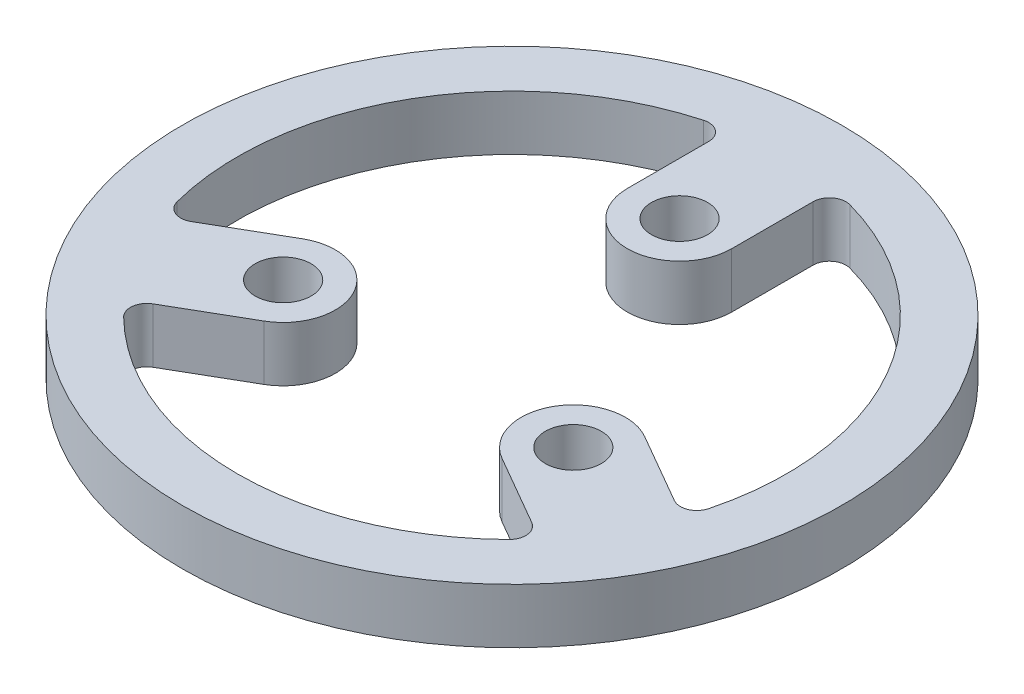
ISO-10303-21;
HEADER;
FILE_DESCRIPTION(('STEP AP214'),'2;1');
FILE_NAME('part.step','',(''),(''),'','','');
FILE_SCHEMA(('AUTOMOTIVE_DESIGN { 1 0 10303 214 1 1 1 1 }'));
ENDSEC;
DATA;
#1=APPLICATION_CONTEXT('core data for automotive mechanical design processes');
#2=APPLICATION_PROTOCOL_DEFINITION('international standard','automotive_design',2000,#1);
#3=PRODUCT_CONTEXT('',#1,'mechanical');
#4=PRODUCT('Part','Part','',(#3));
#5=PRODUCT_RELATED_PRODUCT_CATEGORY('part','',(#4));
#6=PRODUCT_DEFINITION_FORMATION('','',#4);
#7=PRODUCT_DEFINITION_CONTEXT('part definition',#1,'design');
#8=PRODUCT_DEFINITION('design','',#6,#7);
#9=PRODUCT_DEFINITION_SHAPE('','',#8);
#10=(LENGTH_UNIT() NAMED_UNIT(*) SI_UNIT(.MILLI.,.METRE.));
#11=(NAMED_UNIT(*) PLANE_ANGLE_UNIT() SI_UNIT($,.RADIAN.));
#12=(NAMED_UNIT(*) SI_UNIT($,.STERADIAN.) SOLID_ANGLE_UNIT());
#13=UNCERTAINTY_MEASURE_WITH_UNIT(LENGTH_MEASURE(1.E-05),#10,'distance_accuracy_value','');
#14=(GEOMETRIC_REPRESENTATION_CONTEXT(3) GLOBAL_UNCERTAINTY_ASSIGNED_CONTEXT((#13)) GLOBAL_UNIT_ASSIGNED_CONTEXT((#10,
#11,#12)) REPRESENTATION_CONTEXT('',''));
#15=CARTESIAN_POINT('',(0.,0.,0.));
#16=DIRECTION('',(0.,0.,1.));
#17=DIRECTION('',(1.,0.,0.));
#18=AXIS2_PLACEMENT_3D('',#15,#16,#17);
#19=CARTESIAN_POINT('',(0.,5.,0.));
#20=DIRECTION('',(0.,-1.,0.));
#21=DIRECTION('',(0.,0.,-1.));
#22=AXIS2_PLACEMENT_3D('',#19,#20,#21);
#23=CYLINDRICAL_SURFACE('',#22,25.);
#24=CARTESIAN_POINT('',(0.,5.,0.));
#25=DIRECTION('',(0.,1.,0.));
#26=DIRECTION('',(0.,0.,1.));
#27=AXIS2_PLACEMENT_3D('',#24,#25,#26);
#28=CIRCLE('',#27,25.);
#29=CARTESIAN_POINT('',(-6.64893617021277,5.,-24.0996192460469));
#30=VERTEX_POINT('',#29);
#31=CARTESIAN_POINT('',(-24.1953505737155,5.,6.29166199147778));
#32=VERTEX_POINT('',#31);
#33=EDGE_CURVE('E246',#30,#32,#28,.T.);
#34=ORIENTED_EDGE('',*,*,#33,.T.);
#35=DIRECTION('',(0.,-1.,0.));
#36=VECTOR('',#35,1.);
#37=CARTESIAN_POINT('',(-24.1953505737155,5.,6.29166199147778));
#38=LINE('',#37,#36);
#39=CARTESIAN_POINT('',(-24.1953505737155,0.,6.29166199147778));
#40=VERTEX_POINT('',#39);
#41=EDGE_CURVE('E280',#32,#40,#38,.T.);
#42=ORIENTED_EDGE('',*,*,#41,.T.);
#43=CARTESIAN_POINT('',(0.,0.,0.));
#44=DIRECTION('',(0.,1.,0.));
#45=DIRECTION('',(0.,0.,1.));
#46=AXIS2_PLACEMENT_3D('',#43,#44,#45);
#47=CIRCLE('',#46,25.);
#48=CARTESIAN_POINT('',(-6.64893617021277,0.,-24.0996192460469));
#49=VERTEX_POINT('',#48);
#50=EDGE_CURVE('E252',#49,#40,#47,.T.);
#51=ORIENTED_EDGE('',*,*,#50,.F.);
#52=DIRECTION('',(0.,-1.,0.));
#53=VECTOR('',#52,1.);
#54=CARTESIAN_POINT('',(-6.64893617021277,5.,-24.0996192460469));
#55=LINE('',#54,#53);
#56=EDGE_CURVE('E277',#49,#30,#55,.F.);
#57=ORIENTED_EDGE('',*,*,#56,.T.);
#58=EDGE_LOOP('',(#34,#42,#51,#57));
#59=FACE_BOUND('',#58,.T.);
#60=ADVANCED_FACE('F33',(#59),#23,.F.);
#61=CARTESIAN_POINT('',(-17.5464144035028,5.,17.8079572545688));
#62=VERTEX_POINT('',#61);
#63=CARTESIAN_POINT('',(17.5464144035026,5.,17.807957254569));
#64=VERTEX_POINT('',#63);
#65=EDGE_CURVE('E250',#62,#64,#28,.T.);
#66=ORIENTED_EDGE('',*,*,#65,.T.);
#67=DIRECTION('',(0.,-1.,0.));
#68=VECTOR('',#67,1.);
#69=CARTESIAN_POINT('',(17.5464144035026,5.,17.807957254569));
#70=LINE('',#69,#68);
#71=CARTESIAN_POINT('',(17.5464144035026,0.,17.807957254569));
#72=VERTEX_POINT('',#71);
#73=EDGE_CURVE('E274',#64,#72,#70,.T.);
#74=ORIENTED_EDGE('',*,*,#73,.T.);
#75=CARTESIAN_POINT('',(-17.5464144035028,0.,17.8079572545688));
#76=VERTEX_POINT('',#75);
#77=EDGE_CURVE('E255',#76,#72,#47,.T.);
#78=ORIENTED_EDGE('',*,*,#77,.F.);
#79=DIRECTION('',(0.,-1.,0.));
#80=VECTOR('',#79,1.);
#81=CARTESIAN_POINT('',(-17.5464144035028,5.,17.8079572545688));
#82=LINE('',#81,#80);
#83=EDGE_CURVE('E271',#76,#62,#82,.F.);
#84=ORIENTED_EDGE('',*,*,#83,.T.);
#85=EDGE_LOOP('',(#66,#74,#78,#84));
#86=FACE_BOUND('',#85,.T.);
#87=ADVANCED_FACE('F332',(#86),#23,.F.);
#88=CARTESIAN_POINT('',(0.,5.,0.));
#89=DIRECTION('',(0.,1.,0.));
#90=DIRECTION('',(0.,0.,1.));
#91=AXIS2_PLACEMENT_3D('',#88,#89,#90);
#92=PLANE('',#91);
#93=CARTESIAN_POINT('',(0.,5.,0.));
#94=DIRECTION('',(0.,1.,0.));
#95=DIRECTION('',(0.,0.,1.));
#96=AXIS2_PLACEMENT_3D('',#93,#94,#95);
#97=CIRCLE('',#96,30.);
#98=CARTESIAN_POINT('',(0.,5.,30.));
#99=VERTEX_POINT('',#98);
#100=EDGE_CURVE('E256',#99,#99,#97,.T.);
#101=ORIENTED_EDGE('',*,*,#100,.T.);
#102=EDGE_LOOP('',(#101));
#103=FACE_BOUND('',#102,.T.);
#104=ORIENTED_EDGE('',*,*,#33,.F.);
#105=CARTESIAN_POINT('',(-6.25,5.,-22.6536420912841));
#106=DIRECTION('',(0.,1.,0.));
#107=DIRECTION('',(0.,0.,1.));
#108=AXIS2_PLACEMENT_3D('',#105,#106,#107);
#109=CIRCLE('',#108,1.5);
#110=CARTESIAN_POINT('',(-4.75,5.,-22.6536420912841));
#111=VERTEX_POINT('',#110);
#112=EDGE_CURVE('E41',#30,#111,#109,.F.);
#113=ORIENTED_EDGE('',*,*,#112,.T.);
#114=DIRECTION('',(0.,0.,1.));
#115=VECTOR('',#114,1.);
#116=CARTESIAN_POINT('',(-4.75,5.,-15.25));
#117=LINE('',#116,#115);
#118=CARTESIAN_POINT('',(-4.75,5.,-15.25));
#119=VERTEX_POINT('',#118);
#120=EDGE_CURVE('E237',#111,#119,#117,.T.);
#121=ORIENTED_EDGE('',*,*,#120,.T.);
#122=CARTESIAN_POINT('',(0.,5.,-15.25));
#123=DIRECTION('',(0.,1.,0.));
#124=DIRECTION('',(0.,0.,1.));
#125=AXIS2_PLACEMENT_3D('',#122,#123,#124);
#126=CIRCLE('',#125,4.75);
#127=CARTESIAN_POINT('',(4.75,5.,-15.25));
#128=VERTEX_POINT('',#127);
#129=EDGE_CURVE('E231',#119,#128,#126,.T.);
#130=ORIENTED_EDGE('',*,*,#129,.T.);
#131=DIRECTION('',(0.,0.,-1.));
#132=VECTOR('',#131,1.);
#133=CARTESIAN_POINT('',(4.75,5.,-15.25));
#134=LINE('',#133,#132);
#135=CARTESIAN_POINT('',(4.75,5.,-22.6536420912841));
#136=VERTEX_POINT('',#135);
#137=EDGE_CURVE('E234',#128,#136,#134,.T.);
#138=ORIENTED_EDGE('',*,*,#137,.T.);
#139=CARTESIAN_POINT('',(6.25,5.,-22.6536420912841));
#140=DIRECTION('',(0.,1.,0.));
#141=DIRECTION('',(0.,0.,1.));
#142=AXIS2_PLACEMENT_3D('',#139,#140,#141);
#143=CIRCLE('',#142,1.5);
#144=CARTESIAN_POINT('',(6.64893617021277,5.,-24.0996192460469));
#145=VERTEX_POINT('',#144);
#146=EDGE_CURVE('E304',#136,#145,#143,.F.);
#147=ORIENTED_EDGE('',*,*,#146,.T.);
#148=CARTESIAN_POINT('',(24.1953505737154,5.,6.29166199147811));
#149=VERTEX_POINT('',#148);
#150=EDGE_CURVE('E251',#149,#145,#28,.T.);
#151=ORIENTED_EDGE('',*,*,#150,.F.);
#152=CARTESIAN_POINT('',(22.7436295392925,5.,5.91416227198942));
#153=DIRECTION('',(0.,1.,0.));
#154=DIRECTION('',(0.,0.,1.));
#155=AXIS2_PLACEMENT_3D('',#152,#153,#154);
#156=CIRCLE('',#155,1.5);
#157=CARTESIAN_POINT('',(21.9936295392925,5.,7.21320037766608));
#158=VERTEX_POINT('',#157);
#159=EDGE_CURVE('E288',#149,#158,#156,.F.);
#160=ORIENTED_EDGE('',*,*,#159,.T.);
#161=DIRECTION('',(-0.866025403784436,0.,-0.500000000000004));
#162=VECTOR('',#161,1.);
#163=CARTESIAN_POINT('',(15.5818874077127,5.,3.51137933202399));
#164=LINE('',#163,#162);
#165=CARTESIAN_POINT('',(15.5818874077127,5.,3.51137933202399));
#166=VERTEX_POINT('',#165);
#167=EDGE_CURVE('E212',#158,#166,#164,.T.);
#168=ORIENTED_EDGE('',*,*,#167,.T.);
#169=CARTESIAN_POINT('',(13.2068874077127,5.,7.62500000000006));
#170=DIRECTION('',(0.,1.,0.));
#171=DIRECTION('',(-0.866025403784436,0.,-0.500000000000004));
#172=AXIS2_PLACEMENT_3D('',#169,#170,#171);
#173=CIRCLE('',#172,4.75);
#174=CARTESIAN_POINT('',(10.8318874077126,5.,11.7386206679761));
#175=VERTEX_POINT('',#174);
#176=EDGE_CURVE('E206',#166,#175,#173,.T.);
#177=ORIENTED_EDGE('',*,*,#176,.T.);
#178=DIRECTION('',(0.866025403784436,0.,0.500000000000004));
#179=VECTOR('',#178,1.);
#180=CARTESIAN_POINT('',(10.8318874077126,5.,11.7386206679761));
#181=LINE('',#180,#179);
#182=CARTESIAN_POINT('',(17.2436295392924,5.,15.4404417136182));
#183=VERTEX_POINT('',#182);
#184=EDGE_CURVE('E209',#175,#183,#181,.T.);
#185=ORIENTED_EDGE('',*,*,#184,.T.);
#186=CARTESIAN_POINT('',(16.4936295392924,5.,16.7394798192949));
#187=DIRECTION('',(0.,1.,0.));
#188=DIRECTION('',(0.,0.,1.));
#189=AXIS2_PLACEMENT_3D('',#186,#187,#188);
#190=CIRCLE('',#189,1.5);
#191=EDGE_CURVE('E292',#183,#64,#190,.F.);
#192=ORIENTED_EDGE('',*,*,#191,.T.);
#193=ORIENTED_EDGE('',*,*,#65,.F.);
#194=CARTESIAN_POINT('',(-16.4936295392926,5.,16.7394798192947));
#195=DIRECTION('',(0.,1.,0.));
#196=DIRECTION('',(0.,0.,1.));
#197=AXIS2_PLACEMENT_3D('',#194,#195,#196);
#198=CIRCLE('',#197,1.5);
#199=CARTESIAN_POINT('',(-17.2436295392926,5.,15.440441713618));
#200=VERTEX_POINT('',#199);
#201=EDGE_CURVE('E300',#62,#200,#198,.F.);
#202=ORIENTED_EDGE('',*,*,#201,.T.);
#203=DIRECTION('',(0.866025403784443,0.,-0.499999999999992));
#204=VECTOR('',#203,1.);
#205=CARTESIAN_POINT('',(-10.8318874077128,5.,11.738620667976));
#206=LINE('',#205,#204);
#207=CARTESIAN_POINT('',(-10.8318874077128,5.,11.738620667976));
#208=VERTEX_POINT('',#207);
#209=EDGE_CURVE('E168',#200,#208,#206,.T.);
#210=ORIENTED_EDGE('',*,*,#209,.T.);
#211=CARTESIAN_POINT('',(-13.2068874077128,5.,7.62499999999988));
#212=DIRECTION('',(0.,1.,0.));
#213=DIRECTION('',(0.866025403784443,0.,-0.499999999999992));
#214=AXIS2_PLACEMENT_3D('',#211,#212,#213);
#215=CIRCLE('',#214,4.75);
#216=CARTESIAN_POINT('',(-15.5818874077127,5.,3.51137933202377));
#217=VERTEX_POINT('',#216);
#218=EDGE_CURVE('E163',#208,#217,#215,.T.);
#219=ORIENTED_EDGE('',*,*,#218,.T.);
#220=DIRECTION('',(-0.866025403784443,0.,0.499999999999992));
#221=VECTOR('',#220,1.);
#222=CARTESIAN_POINT('',(-15.5818874077127,5.,3.51137933202377));
#223=LINE('',#222,#221);
#224=CARTESIAN_POINT('',(-21.9936295392926,5.,7.21320037766578));
#225=VERTEX_POINT('',#224);
#226=EDGE_CURVE('E172',#217,#225,#223,.T.);
#227=ORIENTED_EDGE('',*,*,#226,.T.);
#228=CARTESIAN_POINT('',(-22.7436295392925,5.,5.91416227198911));
#229=DIRECTION('',(0.,1.,0.));
#230=DIRECTION('',(0.,0.,1.));
#231=AXIS2_PLACEMENT_3D('',#228,#229,#230);
#232=CIRCLE('',#231,1.5);
#233=EDGE_CURVE('E296',#225,#32,#232,.F.);
#234=ORIENTED_EDGE('',*,*,#233,.T.);
#235=EDGE_LOOP('',(#104,#113,#121,#130,#138,#147,#151,#160,#168,#177,#185,#192,#193,#202,#210,
#219,#227,#234));
#236=FACE_BOUND('',#235,.T.);
#237=CARTESIAN_POINT('',(0.,5.,-15.25));
#238=DIRECTION('',(0.,1.,0.));
#239=DIRECTION('',(0.,0.,1.));
#240=AXIS2_PLACEMENT_3D('',#237,#238,#239);
#241=CIRCLE('',#240,2.55);
#242=CARTESIAN_POINT('',(0.,5.,-12.7));
#243=VERTEX_POINT('',#242);
#244=EDGE_CURVE('E220',#243,#243,#241,.T.);
#245=ORIENTED_EDGE('',*,*,#244,.F.);
#246=EDGE_LOOP('',(#245));
#247=FACE_BOUND('',#246,.T.);
#248=CARTESIAN_POINT('',(13.2068874077127,5.,7.62500000000006));
#249=DIRECTION('',(0.,1.,0.));
#250=DIRECTION('',(-0.866025403784436,0.,-0.500000000000004));
#251=AXIS2_PLACEMENT_3D('',#248,#249,#250);
#252=CIRCLE('',#251,2.55);
#253=CARTESIAN_POINT('',(10.9985226280623,5.,6.35000000000005));
#254=VERTEX_POINT('',#253);
#255=EDGE_CURVE('E193',#254,#254,#252,.T.);
#256=ORIENTED_EDGE('',*,*,#255,.F.);
#257=EDGE_LOOP('',(#256));
#258=FACE_BOUND('',#257,.T.);
#259=CARTESIAN_POINT('',(-13.2068874077128,5.,7.62499999999988));
#260=DIRECTION('',(0.,1.,0.));
#261=DIRECTION('',(0.866025403784443,0.,-0.499999999999992));
#262=AXIS2_PLACEMENT_3D('',#259,#260,#261);
#263=CIRCLE('',#262,2.55);
#264=CARTESIAN_POINT('',(-10.9985226280624,5.,6.3499999999999));
#265=VERTEX_POINT('',#264);
#266=EDGE_CURVE('E181',#265,#265,#263,.T.);
#267=ORIENTED_EDGE('',*,*,#266,.F.);
#268=EDGE_LOOP('',(#267));
#269=FACE_BOUND('',#268,.T.);
#270=ADVANCED_FACE('F177',(#103,#236,#247,#258,#269),#92,.T.);
#271=CARTESIAN_POINT('',(0.,0.,0.));
#272=DIRECTION('',(0.,1.,0.));
#273=DIRECTION('',(0.,0.,1.));
#274=AXIS2_PLACEMENT_3D('',#271,#272,#273);
#275=PLANE('',#274);
#276=CARTESIAN_POINT('',(0.,0.,0.));
#277=DIRECTION('',(0.,1.,0.));
#278=DIRECTION('',(0.,0.,1.));
#279=AXIS2_PLACEMENT_3D('',#276,#277,#278);
#280=CIRCLE('',#279,30.);
#281=CARTESIAN_POINT('',(0.,0.,30.));
#282=VERTEX_POINT('',#281);
#283=EDGE_CURVE('E249',#282,#282,#280,.T.);
#284=ORIENTED_EDGE('',*,*,#283,.F.);
#285=EDGE_LOOP('',(#284));
#286=FACE_BOUND('',#285,.T.);
#287=DIRECTION('',(0.,0.,-1.));
#288=VECTOR('',#287,1.);
#289=CARTESIAN_POINT('',(-4.75,0.,-15.25));
#290=LINE('',#289,#288);
#291=CARTESIAN_POINT('',(-4.75,0.,-15.25));
#292=VERTEX_POINT('',#291);
#293=CARTESIAN_POINT('',(-4.75,0.,-22.6536420912841));
#294=VERTEX_POINT('',#293);
#295=EDGE_CURVE('E225',#292,#294,#290,.T.);
#296=ORIENTED_EDGE('',*,*,#295,.T.);
#297=CARTESIAN_POINT('',(-6.25,0.,-22.6536420912841));
#298=DIRECTION('',(0.,1.,0.));
#299=DIRECTION('',(0.,0.,1.));
#300=AXIS2_PLACEMENT_3D('',#297,#298,#299);
#301=CIRCLE('',#300,1.5);
#302=EDGE_CURVE('E11',#294,#49,#301,.T.);
#303=ORIENTED_EDGE('',*,*,#302,.T.);
#304=ORIENTED_EDGE('',*,*,#50,.T.);
#305=CARTESIAN_POINT('',(-22.7436295392925,0.,5.91416227198911));
#306=DIRECTION('',(0.,1.,0.));
#307=DIRECTION('',(0.,0.,1.));
#308=AXIS2_PLACEMENT_3D('',#305,#306,#307);
#309=CIRCLE('',#308,1.5);
#310=CARTESIAN_POINT('',(-21.9936295392926,0.,7.21320037766578));
#311=VERTEX_POINT('',#310);
#312=EDGE_CURVE('E298',#40,#311,#309,.T.);
#313=ORIENTED_EDGE('',*,*,#312,.T.);
#314=DIRECTION('',(0.866025403784443,0.,-0.499999999999992));
#315=VECTOR('',#314,1.);
#316=CARTESIAN_POINT('',(-15.5818874077127,0.,3.51137933202377));
#317=LINE('',#316,#315);
#318=CARTESIAN_POINT('',(-15.5818874077127,0.,3.51137933202377));
#319=VERTEX_POINT('',#318);
#320=EDGE_CURVE('E194',#311,#319,#317,.T.);
#321=ORIENTED_EDGE('',*,*,#320,.T.);
#322=CARTESIAN_POINT('',(-13.2068874077128,0.,7.62499999999988));
#323=DIRECTION('',(0.,1.,0.));
#324=DIRECTION('',(0.,0.,1.));
#325=AXIS2_PLACEMENT_3D('',#322,#323,#324);
#326=CIRCLE('',#325,4.75);
#327=CARTESIAN_POINT('',(-10.8318874077128,0.,11.738620667976));
#328=VERTEX_POINT('',#327);
#329=EDGE_CURVE('E164',#319,#328,#326,.F.);
#330=ORIENTED_EDGE('',*,*,#329,.T.);
#331=DIRECTION('',(-0.866025403784443,0.,0.499999999999992));
#332=VECTOR('',#331,1.);
#333=CARTESIAN_POINT('',(-10.8318874077128,0.,11.738620667976));
#334=LINE('',#333,#332);
#335=CARTESIAN_POINT('',(-17.2436295392926,0.,15.440441713618));
#336=VERTEX_POINT('',#335);
#337=EDGE_CURVE('E188',#328,#336,#334,.T.);
#338=ORIENTED_EDGE('',*,*,#337,.T.);
#339=CARTESIAN_POINT('',(-16.4936295392926,0.,16.7394798192947));
#340=DIRECTION('',(0.,1.,0.));
#341=DIRECTION('',(0.,0.,1.));
#342=AXIS2_PLACEMENT_3D('',#339,#340,#341);
#343=CIRCLE('',#342,1.5);
#344=EDGE_CURVE('E302',#336,#76,#343,.T.);
#345=ORIENTED_EDGE('',*,*,#344,.T.);
#346=ORIENTED_EDGE('',*,*,#77,.T.);
#347=CARTESIAN_POINT('',(16.4936295392924,0.,16.7394798192949));
#348=DIRECTION('',(0.,1.,0.));
#349=DIRECTION('',(0.,0.,1.));
#350=AXIS2_PLACEMENT_3D('',#347,#348,#349);
#351=CIRCLE('',#350,1.5);
#352=CARTESIAN_POINT('',(17.2436295392924,0.,15.4404417136182));
#353=VERTEX_POINT('',#352);
#354=EDGE_CURVE('E294',#72,#353,#351,.T.);
#355=ORIENTED_EDGE('',*,*,#354,.T.);
#356=DIRECTION('',(-0.866025403784436,0.,-0.500000000000004));
#357=VECTOR('',#356,1.);
#358=CARTESIAN_POINT('',(10.8318874077126,0.,11.7386206679761));
#359=LINE('',#358,#357);
#360=CARTESIAN_POINT('',(10.8318874077126,0.,11.7386206679761));
#361=VERTEX_POINT('',#360);
#362=EDGE_CURVE('E195',#353,#361,#359,.T.);
#363=ORIENTED_EDGE('',*,*,#362,.T.);
#364=CARTESIAN_POINT('',(13.2068874077127,0.,7.62500000000006));
#365=DIRECTION('',(0.,1.,0.));
#366=DIRECTION('',(0.,0.,1.));
#367=AXIS2_PLACEMENT_3D('',#364,#365,#366);
#368=CIRCLE('',#367,4.75);
#369=CARTESIAN_POINT('',(15.5818874077127,0.,3.51137933202399));
#370=VERTEX_POINT('',#369);
#371=EDGE_CURVE('E198',#361,#370,#368,.F.);
#372=ORIENTED_EDGE('',*,*,#371,.T.);
#373=DIRECTION('',(0.866025403784436,0.,0.500000000000004));
#374=VECTOR('',#373,1.);
#375=CARTESIAN_POINT('',(15.5818874077127,0.,3.51137933202399));
#376=LINE('',#375,#374);
#377=CARTESIAN_POINT('',(21.9936295392925,0.,7.21320037766608));
#378=VERTEX_POINT('',#377);
#379=EDGE_CURVE('E199',#370,#378,#376,.T.);
#380=ORIENTED_EDGE('',*,*,#379,.T.);
#381=CARTESIAN_POINT('',(22.7436295392925,0.,5.91416227198942));
#382=DIRECTION('',(0.,1.,0.));
#383=DIRECTION('',(0.,0.,1.));
#384=AXIS2_PLACEMENT_3D('',#381,#382,#383);
#385=CIRCLE('',#384,1.5);
#386=CARTESIAN_POINT('',(24.1953505737154,0.,6.29166199147811));
#387=VERTEX_POINT('',#386);
#388=EDGE_CURVE('E290',#378,#387,#385,.T.);
#389=ORIENTED_EDGE('',*,*,#388,.T.);
#390=CARTESIAN_POINT('',(6.64893617021277,0.,-24.0996192460469));
#391=VERTEX_POINT('',#390);
#392=EDGE_CURVE('E245',#387,#391,#47,.T.);
#393=ORIENTED_EDGE('',*,*,#392,.T.);
#394=CARTESIAN_POINT('',(6.25,0.,-22.6536420912841));
#395=DIRECTION('',(0.,1.,0.));
#396=DIRECTION('',(0.,0.,1.));
#397=AXIS2_PLACEMENT_3D('',#394,#395,#396);
#398=CIRCLE('',#397,1.5);
#399=CARTESIAN_POINT('',(4.75,0.,-22.6536420912841));
#400=VERTEX_POINT('',#399);
#401=EDGE_CURVE('E306',#391,#400,#398,.T.);
#402=ORIENTED_EDGE('',*,*,#401,.T.);
#403=DIRECTION('',(0.,0.,1.));
#404=VECTOR('',#403,1.);
#405=CARTESIAN_POINT('',(4.75,0.,-15.25));
#406=LINE('',#405,#404);
#407=CARTESIAN_POINT('',(4.75,0.,-15.25));
#408=VERTEX_POINT('',#407);
#409=EDGE_CURVE('E221',#400,#408,#406,.T.);
#410=ORIENTED_EDGE('',*,*,#409,.T.);
#411=CARTESIAN_POINT('',(0.,0.,-15.25));
#412=DIRECTION('',(0.,1.,0.));
#413=DIRECTION('',(0.,0.,1.));
#414=AXIS2_PLACEMENT_3D('',#411,#412,#413);
#415=CIRCLE('',#414,4.75);
#416=EDGE_CURVE('E224',#408,#292,#415,.F.);
#417=ORIENTED_EDGE('',*,*,#416,.T.);
#418=EDGE_LOOP('',(#296,#303,#304,#313,#321,#330,#338,#345,#346,#355,#363,#372,#380,#389,#393,
#402,#410,#417));
#419=FACE_BOUND('',#418,.T.);
#420=CARTESIAN_POINT('',(0.,0.,-15.25));
#421=DIRECTION('',(0.,1.,0.));
#422=DIRECTION('',(0.,0.,1.));
#423=AXIS2_PLACEMENT_3D('',#420,#421,#422);
#424=CIRCLE('',#423,2.55);
#425=CARTESIAN_POINT('',(0.,0.,-12.7));
#426=VERTEX_POINT('',#425);
#427=EDGE_CURVE('E223',#426,#426,#424,.F.);
#428=ORIENTED_EDGE('',*,*,#427,.F.);
#429=EDGE_LOOP('',(#428));
#430=FACE_BOUND('',#429,.T.);
#431=CARTESIAN_POINT('',(13.2068874077127,0.,7.62500000000006));
#432=DIRECTION('',(0.,1.,0.));
#433=DIRECTION('',(0.,0.,1.));
#434=AXIS2_PLACEMENT_3D('',#431,#432,#433);
#435=CIRCLE('',#434,2.55);
#436=CARTESIAN_POINT('',(13.2068874077127,0.,10.1750000000001));
#437=VERTEX_POINT('',#436);
#438=EDGE_CURVE('E197',#437,#437,#435,.F.);
#439=ORIENTED_EDGE('',*,*,#438,.F.);
#440=EDGE_LOOP('',(#439));
#441=FACE_BOUND('',#440,.T.);
#442=CARTESIAN_POINT('',(-13.2068874077128,0.,7.62499999999988));
#443=DIRECTION('',(0.,1.,0.));
#444=DIRECTION('',(0.,0.,1.));
#445=AXIS2_PLACEMENT_3D('',#442,#443,#444);
#446=CIRCLE('',#445,2.55);
#447=CARTESIAN_POINT('',(-13.2068874077128,0.,10.1749999999999));
#448=VERTEX_POINT('',#447);
#449=EDGE_CURVE('E190',#448,#448,#446,.F.);
#450=ORIENTED_EDGE('',*,*,#449,.F.);
#451=EDGE_LOOP('',(#450));
#452=FACE_BOUND('',#451,.T.);
#453=ADVANCED_FACE('F311',(#286,#419,#430,#441,#452),#275,.F.);
#454=CARTESIAN_POINT('',(0.,5.,0.));
#455=DIRECTION('',(0.,-1.,0.));
#456=DIRECTION('',(0.,0.,-1.));
#457=AXIS2_PLACEMENT_3D('',#454,#455,#456);
#458=CYLINDRICAL_SURFACE('',#457,30.);
#459=ORIENTED_EDGE('',*,*,#100,.F.);
#460=EDGE_LOOP('',(#459));
#461=FACE_BOUND('',#460,.T.);
#462=ORIENTED_EDGE('',*,*,#283,.T.);
#463=EDGE_LOOP('',(#462));
#464=FACE_BOUND('',#463,.T.);
#465=ADVANCED_FACE('F379',(#461,#464),#458,.T.);
#466=ORIENTED_EDGE('',*,*,#392,.F.);
#467=DIRECTION('',(0.,-1.,0.));
#468=VECTOR('',#467,1.);
#469=CARTESIAN_POINT('',(24.1953505737154,5.,6.29166199147811));
#470=LINE('',#469,#468);
#471=EDGE_CURVE('E263',#387,#149,#470,.F.);
#472=ORIENTED_EDGE('',*,*,#471,.T.);
#473=ORIENTED_EDGE('',*,*,#150,.T.);
#474=DIRECTION('',(0.,-1.,0.));
#475=VECTOR('',#474,1.);
#476=CARTESIAN_POINT('',(6.64893617021277,5.,-24.0996192460469));
#477=LINE('',#476,#475);
#478=EDGE_CURVE('E259',#145,#391,#477,.T.);
#479=ORIENTED_EDGE('',*,*,#478,.T.);
#480=EDGE_LOOP('',(#466,#472,#473,#479));
#481=FACE_BOUND('',#480,.T.);
#482=ADVANCED_FACE('F326',(#481),#23,.F.);
#483=CARTESIAN_POINT('',(4.75,-17.3349358233597,-15.25));
#484=DIRECTION('',(1.,0.,0.));
#485=DIRECTION('',(0.,0.,-1.));
#486=AXIS2_PLACEMENT_3D('',#483,#484,#485);
#487=PLANE('',#486);
#488=ORIENTED_EDGE('',*,*,#409,.F.);
#489=DIRECTION('',(0.,1.,0.));
#490=VECTOR('',#489,1.);
#491=CARTESIAN_POINT('',(4.75,5.,-22.6536420912841));
#492=LINE('',#491,#490);
#493=EDGE_CURVE('E284',#400,#136,#492,.T.);
#494=ORIENTED_EDGE('',*,*,#493,.T.);
#495=ORIENTED_EDGE('',*,*,#137,.F.);
#496=DIRECTION('',(0.,1.,0.));
#497=VECTOR('',#496,1.);
#498=CARTESIAN_POINT('',(4.75,-17.3349358233597,-15.25));
#499=LINE('',#498,#497);
#500=EDGE_CURVE('E239',#408,#128,#499,.T.);
#501=ORIENTED_EDGE('',*,*,#500,.F.);
#502=EDGE_LOOP('',(#488,#494,#495,#501));
#503=FACE_BOUND('',#502,.T.);
#504=ADVANCED_FACE('F320',(#503),#487,.T.);
#505=CARTESIAN_POINT('',(-4.75,-17.3349358233597,-15.25));
#506=DIRECTION('',(-1.,0.,0.));
#507=DIRECTION('',(0.,0.,1.));
#508=AXIS2_PLACEMENT_3D('',#505,#506,#507);
#509=PLANE('',#508);
#510=ORIENTED_EDGE('',*,*,#120,.F.);
#511=DIRECTION('',(0.,1.,0.));
#512=VECTOR('',#511,1.);
#513=CARTESIAN_POINT('',(-4.75,0.,-22.6536420912841));
#514=LINE('',#513,#512);
#515=EDGE_CURVE('E54',#111,#294,#514,.F.);
#516=ORIENTED_EDGE('',*,*,#515,.T.);
#517=ORIENTED_EDGE('',*,*,#295,.F.);
#518=DIRECTION('',(0.,1.,0.));
#519=VECTOR('',#518,1.);
#520=CARTESIAN_POINT('',(-4.75,-17.3349358233597,-15.25));
#521=LINE('',#520,#519);
#522=EDGE_CURVE('E227',#292,#119,#521,.T.);
#523=ORIENTED_EDGE('',*,*,#522,.T.);
#524=EDGE_LOOP('',(#510,#516,#517,#523));
#525=FACE_BOUND('',#524,.T.);
#526=ADVANCED_FACE('F384',(#525),#509,.T.);
#527=CARTESIAN_POINT('',(0.,-17.3349358233597,-15.25));
#528=DIRECTION('',(0.,1.,0.));
#529=DIRECTION('',(0.,0.,1.));
#530=AXIS2_PLACEMENT_3D('',#527,#528,#529);
#531=CYLINDRICAL_SURFACE('',#530,4.75);
#532=ORIENTED_EDGE('',*,*,#416,.F.);
#533=ORIENTED_EDGE('',*,*,#500,.T.);
#534=ORIENTED_EDGE('',*,*,#129,.F.);
#535=ORIENTED_EDGE('',*,*,#522,.F.);
#536=EDGE_LOOP('',(#532,#533,#534,#535));
#537=FACE_BOUND('',#536,.T.);
#538=ADVANCED_FACE('F428',(#537),#531,.T.);
#539=CARTESIAN_POINT('',(0.,-17.3349358233597,-15.25));
#540=DIRECTION('',(0.,1.,0.));
#541=DIRECTION('',(0.,0.,1.));
#542=AXIS2_PLACEMENT_3D('',#539,#540,#541);
#543=CYLINDRICAL_SURFACE('',#542,2.55);
#544=ORIENTED_EDGE('',*,*,#427,.T.);
#545=EDGE_LOOP('',(#544));
#546=FACE_BOUND('',#545,.T.);
#547=ORIENTED_EDGE('',*,*,#244,.T.);
#548=EDGE_LOOP('',(#547));
#549=FACE_BOUND('',#548,.T.);
#550=ADVANCED_FACE('F438',(#546,#549),#543,.F.);
#551=CARTESIAN_POINT('',(10.8318874077126,-20.3176342126593,11.7386206679761));
#552=DIRECTION('',(-0.500000000000004,0.,0.866025403784436));
#553=DIRECTION('',(0.866025403784436,0.,0.500000000000004));
#554=AXIS2_PLACEMENT_3D('',#551,#552,#553);
#555=PLANE('',#554);
#556=ORIENTED_EDGE('',*,*,#362,.F.);
#557=DIRECTION('',(0.,1.,0.));
#558=VECTOR('',#557,1.);
#559=CARTESIAN_POINT('',(17.2436295392924,5.,15.4404417136182));
#560=LINE('',#559,#558);
#561=EDGE_CURVE('E268',#353,#183,#560,.T.);
#562=ORIENTED_EDGE('',*,*,#561,.T.);
#563=ORIENTED_EDGE('',*,*,#184,.F.);
#564=DIRECTION('',(0.,1.,0.));
#565=VECTOR('',#564,1.);
#566=CARTESIAN_POINT('',(10.8318874077126,-20.3176342126593,11.7386206679761));
#567=LINE('',#566,#565);
#568=EDGE_CURVE('E214',#361,#175,#567,.T.);
#569=ORIENTED_EDGE('',*,*,#568,.F.);
#570=EDGE_LOOP('',(#556,#562,#563,#569));
#571=FACE_BOUND('',#570,.T.);
#572=ADVANCED_FACE('F344',(#571),#555,.T.);
#573=CARTESIAN_POINT('',(15.5818874077127,-20.3176342126593,3.51137933202399));
#574=DIRECTION('',(0.500000000000004,0.,-0.866025403784436));
#575=DIRECTION('',(-0.866025403784436,0.,-0.500000000000004));
#576=AXIS2_PLACEMENT_3D('',#573,#574,#575);
#577=PLANE('',#576);
#578=ORIENTED_EDGE('',*,*,#167,.F.);
#579=DIRECTION('',(0.,1.,0.));
#580=VECTOR('',#579,1.);
#581=CARTESIAN_POINT('',(21.9936295392925,0.,7.21320037766608));
#582=LINE('',#581,#580);
#583=EDGE_CURVE('E266',#158,#378,#582,.F.);
#584=ORIENTED_EDGE('',*,*,#583,.T.);
#585=ORIENTED_EDGE('',*,*,#379,.F.);
#586=DIRECTION('',(0.,1.,0.));
#587=VECTOR('',#586,1.);
#588=CARTESIAN_POINT('',(15.5818874077127,-20.3176342126593,3.51137933202399));
#589=LINE('',#588,#587);
#590=EDGE_CURVE('E202',#370,#166,#589,.T.);
#591=ORIENTED_EDGE('',*,*,#590,.T.);
#592=EDGE_LOOP('',(#578,#584,#585,#591));
#593=FACE_BOUND('',#592,.T.);
#594=ADVANCED_FACE('F354',(#593),#577,.T.);
#595=CARTESIAN_POINT('',(13.2068874077127,-20.3176342126593,7.62500000000006));
#596=DIRECTION('',(0.,1.,0.));
#597=DIRECTION('',(0.,0.,1.));
#598=AXIS2_PLACEMENT_3D('',#595,#596,#597);
#599=CYLINDRICAL_SURFACE('',#598,4.75);
#600=ORIENTED_EDGE('',*,*,#371,.F.);
#601=ORIENTED_EDGE('',*,*,#568,.T.);
#602=ORIENTED_EDGE('',*,*,#176,.F.);
#603=ORIENTED_EDGE('',*,*,#590,.F.);
#604=EDGE_LOOP('',(#600,#601,#602,#603));
#605=FACE_BOUND('',#604,.T.);
#606=ADVANCED_FACE('F348',(#605),#599,.T.);
#607=CARTESIAN_POINT('',(13.2068874077127,-20.3176342126593,7.62500000000006));
#608=DIRECTION('',(0.,1.,0.));
#609=DIRECTION('',(0.,0.,1.));
#610=AXIS2_PLACEMENT_3D('',#607,#608,#609);
#611=CYLINDRICAL_SURFACE('',#610,2.55);
#612=ORIENTED_EDGE('',*,*,#438,.T.);
#613=EDGE_LOOP('',(#612));
#614=FACE_BOUND('',#613,.T.);
#615=ORIENTED_EDGE('',*,*,#255,.T.);
#616=EDGE_LOOP('',(#615));
#617=FACE_BOUND('',#616,.T.);
#618=ADVANCED_FACE('F459',(#614,#617),#611,.F.);
#619=CARTESIAN_POINT('',(-15.5818874077127,-20.3176342126593,3.51137933202377));
#620=DIRECTION('',(-0.499999999999992,0.,-0.866025403784443));
#621=DIRECTION('',(-0.866025403784443,0.,0.499999999999992));
#622=AXIS2_PLACEMENT_3D('',#619,#620,#621);
#623=PLANE('',#622);
#624=ORIENTED_EDGE('',*,*,#320,.F.);
#625=DIRECTION('',(0.,1.,0.));
#626=VECTOR('',#625,1.);
#627=CARTESIAN_POINT('',(-21.9936295392926,5.,7.21320037766578));
#628=LINE('',#627,#626);
#629=EDGE_CURVE('E175',#311,#225,#628,.T.);
#630=ORIENTED_EDGE('',*,*,#629,.T.);
#631=ORIENTED_EDGE('',*,*,#226,.F.);
#632=DIRECTION('',(0.,1.,0.));
#633=VECTOR('',#632,1.);
#634=CARTESIAN_POINT('',(-15.5818874077127,-20.3176342126593,3.51137933202377));
#635=LINE('',#634,#633);
#636=EDGE_CURVE('E158',#319,#217,#635,.T.);
#637=ORIENTED_EDGE('',*,*,#636,.F.);
#638=EDGE_LOOP('',(#624,#630,#631,#637));
#639=FACE_BOUND('',#638,.T.);
#640=ADVANCED_FACE('F173',(#639),#623,.T.);
#641=CARTESIAN_POINT('',(-10.8318874077128,-20.3176342126593,11.738620667976));
#642=DIRECTION('',(0.499999999999992,0.,0.866025403784443));
#643=DIRECTION('',(0.866025403784443,0.,-0.499999999999992));
#644=AXIS2_PLACEMENT_3D('',#641,#642,#643);
#645=PLANE('',#644);
#646=ORIENTED_EDGE('',*,*,#209,.F.);
#647=DIRECTION('',(0.,1.,0.));
#648=VECTOR('',#647,1.);
#649=CARTESIAN_POINT('',(-17.2436295392926,0.,15.440441713618));
#650=LINE('',#649,#648);
#651=EDGE_CURVE('E282',#200,#336,#650,.F.);
#652=ORIENTED_EDGE('',*,*,#651,.T.);
#653=ORIENTED_EDGE('',*,*,#337,.F.);
#654=DIRECTION('',(0.,1.,0.));
#655=VECTOR('',#654,1.);
#656=CARTESIAN_POINT('',(-10.8318874077128,-20.3176342126593,11.738620667976));
#657=LINE('',#656,#655);
#658=EDGE_CURVE('E167',#328,#208,#657,.T.);
#659=ORIENTED_EDGE('',*,*,#658,.T.);
#660=EDGE_LOOP('',(#646,#652,#653,#659));
#661=FACE_BOUND('',#660,.T.);
#662=ADVANCED_FACE('F458',(#661),#645,.T.);
#663=CARTESIAN_POINT('',(-13.2068874077128,-20.3176342126593,7.62499999999988));
#664=DIRECTION('',(0.,1.,0.));
#665=DIRECTION('',(0.,0.,1.));
#666=AXIS2_PLACEMENT_3D('',#663,#664,#665);
#667=CYLINDRICAL_SURFACE('',#666,4.75);
#668=ORIENTED_EDGE('',*,*,#329,.F.);
#669=ORIENTED_EDGE('',*,*,#636,.T.);
#670=ORIENTED_EDGE('',*,*,#218,.F.);
#671=ORIENTED_EDGE('',*,*,#658,.F.);
#672=EDGE_LOOP('',(#668,#669,#670,#671));
#673=FACE_BOUND('',#672,.T.);
#674=ADVANCED_FACE('F160',(#673),#667,.T.);
#675=CARTESIAN_POINT('',(-13.2068874077128,-20.3176342126593,7.62499999999988));
#676=DIRECTION('',(0.,1.,0.));
#677=DIRECTION('',(0.,0.,1.));
#678=AXIS2_PLACEMENT_3D('',#675,#676,#677);
#679=CYLINDRICAL_SURFACE('',#678,2.55);
#680=ORIENTED_EDGE('',*,*,#449,.T.);
#681=EDGE_LOOP('',(#680));
#682=FACE_BOUND('',#681,.T.);
#683=ORIENTED_EDGE('',*,*,#266,.T.);
#684=EDGE_LOOP('',(#683));
#685=FACE_BOUND('',#684,.T.);
#686=ADVANCED_FACE('F359',(#682,#685),#679,.F.);
#687=CARTESIAN_POINT('',(22.7436295392925,5.,5.91416227198942));
#688=DIRECTION('',(0.,-1.,0.));
#689=DIRECTION('',(0.,0.,-1.));
#690=AXIS2_PLACEMENT_3D('',#687,#688,#689);
#691=CYLINDRICAL_SURFACE('',#690,1.5);
#692=ORIENTED_EDGE('',*,*,#388,.F.);
#693=ORIENTED_EDGE('',*,*,#583,.F.);
#694=ORIENTED_EDGE('',*,*,#159,.F.);
#695=ORIENTED_EDGE('',*,*,#471,.F.);
#696=EDGE_LOOP('',(#692,#693,#694,#695));
#697=FACE_BOUND('',#696,.T.);
#698=ADVANCED_FACE('F357',(#697),#691,.F.);
#699=CARTESIAN_POINT('',(16.4936295392924,5.,16.7394798192949));
#700=DIRECTION('',(0.,-1.,0.));
#701=DIRECTION('',(0.,0.,-1.));
#702=AXIS2_PLACEMENT_3D('',#699,#700,#701);
#703=CYLINDRICAL_SURFACE('',#702,1.5);
#704=ORIENTED_EDGE('',*,*,#354,.F.);
#705=ORIENTED_EDGE('',*,*,#73,.F.);
#706=ORIENTED_EDGE('',*,*,#191,.F.);
#707=ORIENTED_EDGE('',*,*,#561,.F.);
#708=EDGE_LOOP('',(#704,#705,#706,#707));
#709=FACE_BOUND('',#708,.T.);
#710=ADVANCED_FACE('F338',(#709),#703,.F.);
#711=CARTESIAN_POINT('',(-22.7436295392925,5.,5.91416227198911));
#712=DIRECTION('',(0.,-1.,0.));
#713=DIRECTION('',(0.,0.,-1.));
#714=AXIS2_PLACEMENT_3D('',#711,#712,#713);
#715=CYLINDRICAL_SURFACE('',#714,1.5);
#716=ORIENTED_EDGE('',*,*,#312,.F.);
#717=ORIENTED_EDGE('',*,*,#41,.F.);
#718=ORIENTED_EDGE('',*,*,#233,.F.);
#719=ORIENTED_EDGE('',*,*,#629,.F.);
#720=EDGE_LOOP('',(#716,#717,#718,#719));
#721=FACE_BOUND('',#720,.T.);
#722=ADVANCED_FACE('F365',(#721),#715,.F.);
#723=CARTESIAN_POINT('',(-16.4936295392926,5.,16.7394798192947));
#724=DIRECTION('',(0.,-1.,0.));
#725=DIRECTION('',(0.,0.,-1.));
#726=AXIS2_PLACEMENT_3D('',#723,#724,#725);
#727=CYLINDRICAL_SURFACE('',#726,1.5);
#728=ORIENTED_EDGE('',*,*,#344,.F.);
#729=ORIENTED_EDGE('',*,*,#651,.F.);
#730=ORIENTED_EDGE('',*,*,#201,.F.);
#731=ORIENTED_EDGE('',*,*,#83,.F.);
#732=EDGE_LOOP('',(#728,#729,#730,#731));
#733=FACE_BOUND('',#732,.T.);
#734=ADVANCED_FACE('F492',(#733),#727,.F.);
#735=CARTESIAN_POINT('',(6.25,5.,-22.6536420912841));
#736=DIRECTION('',(0.,-1.,0.));
#737=DIRECTION('',(0.,0.,-1.));
#738=AXIS2_PLACEMENT_3D('',#735,#736,#737);
#739=CYLINDRICAL_SURFACE('',#738,1.5);
#740=ORIENTED_EDGE('',*,*,#401,.F.);
#741=ORIENTED_EDGE('',*,*,#478,.F.);
#742=ORIENTED_EDGE('',*,*,#146,.F.);
#743=ORIENTED_EDGE('',*,*,#493,.F.);
#744=EDGE_LOOP('',(#740,#741,#742,#743));
#745=FACE_BOUND('',#744,.T.);
#746=ADVANCED_FACE('F322',(#745),#739,.F.);
#747=CARTESIAN_POINT('',(-6.25,5.,-22.6536420912841));
#748=DIRECTION('',(0.,-1.,0.));
#749=DIRECTION('',(0.,0.,-1.));
#750=AXIS2_PLACEMENT_3D('',#747,#748,#749);
#751=CYLINDRICAL_SURFACE('',#750,1.5);
#752=ORIENTED_EDGE('',*,*,#302,.F.);
#753=ORIENTED_EDGE('',*,*,#515,.F.);
#754=ORIENTED_EDGE('',*,*,#112,.F.);
#755=ORIENTED_EDGE('',*,*,#56,.F.);
#756=EDGE_LOOP('',(#752,#753,#754,#755));
#757=FACE_BOUND('',#756,.T.);
#758=ADVANCED_FACE('F35',(#757),#751,.F.);
#759=CLOSED_SHELL('',(#60,#87,#270,#453,#465,#482,#504,#526,#538,#550,#572,#594,#606,#618,#640,
#662,#674,#686,#698,#710,#722,#734,#746,#758));
#760=MANIFOLD_SOLID_BREP('B2',#759);
#761=ADVANCED_BREP_SHAPE_REPRESENTATION('',(#18,#760),#14);
#762=SHAPE_DEFINITION_REPRESENTATION(#9,#761);
ENDSEC;
END-ISO-10303-21;
